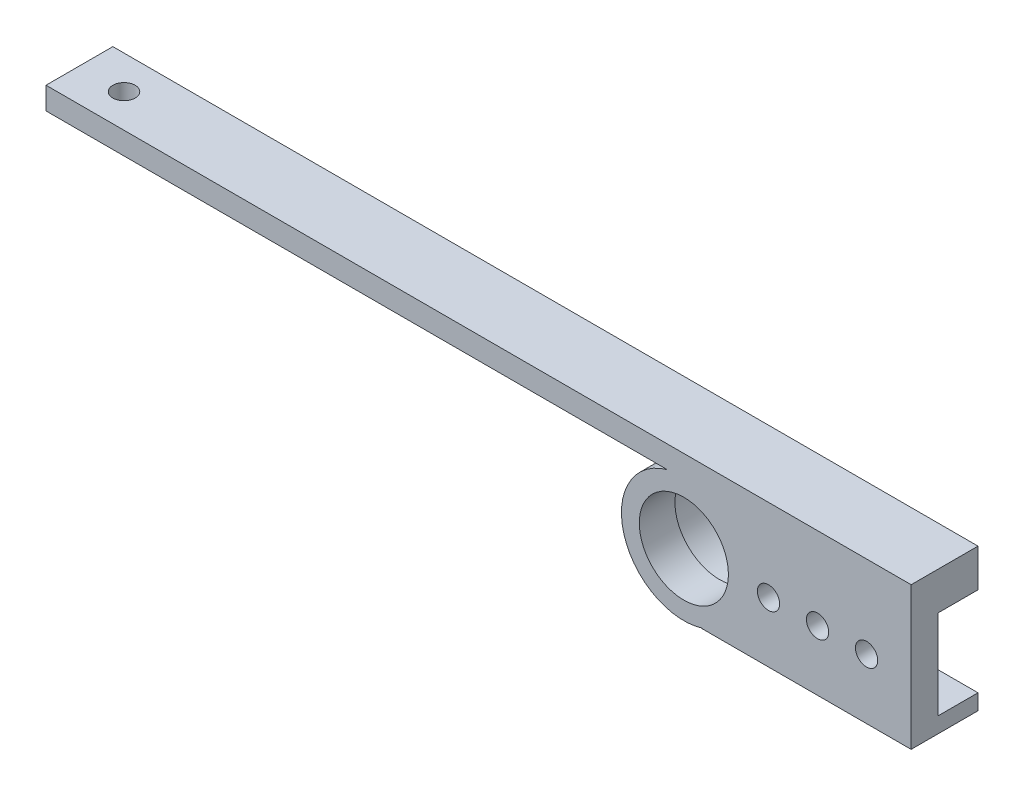
ISO-10303-21;
HEADER;
FILE_DESCRIPTION(('STEP AP214'),'2;1');
FILE_NAME('part.step','',(''),(''),'','','');
FILE_SCHEMA(('AUTOMOTIVE_DESIGN { 1 0 10303 214 1 1 1 1 }'));
ENDSEC;
DATA;
#1=APPLICATION_CONTEXT('core data for automotive mechanical design processes');
#2=APPLICATION_PROTOCOL_DEFINITION('international standard','automotive_design',2000,#1);
#3=PRODUCT_CONTEXT('',#1,'mechanical');
#4=PRODUCT('Part','Part','',(#3));
#5=PRODUCT_RELATED_PRODUCT_CATEGORY('part','',(#4));
#6=PRODUCT_DEFINITION_FORMATION('','',#4);
#7=PRODUCT_DEFINITION_CONTEXT('part definition',#1,'design');
#8=PRODUCT_DEFINITION('design','',#6,#7);
#9=PRODUCT_DEFINITION_SHAPE('','',#8);
#10=(LENGTH_UNIT() NAMED_UNIT(*) SI_UNIT(.MILLI.,.METRE.));
#11=(NAMED_UNIT(*) PLANE_ANGLE_UNIT() SI_UNIT($,.RADIAN.));
#12=(NAMED_UNIT(*) SI_UNIT($,.STERADIAN.) SOLID_ANGLE_UNIT());
#13=UNCERTAINTY_MEASURE_WITH_UNIT(LENGTH_MEASURE(1.E-05),#10,'distance_accuracy_value','');
#14=(GEOMETRIC_REPRESENTATION_CONTEXT(3) GLOBAL_UNCERTAINTY_ASSIGNED_CONTEXT((#13)) GLOBAL_UNIT_ASSIGNED_CONTEXT((#10,
#11,#12)) REPRESENTATION_CONTEXT('',''));
#15=CARTESIAN_POINT('',(0.,0.,0.));
#16=DIRECTION('',(0.,0.,1.));
#17=DIRECTION('',(1.,0.,0.));
#18=AXIS2_PLACEMENT_3D('',#15,#16,#17);
#19=CARTESIAN_POINT('',(-31.,0.,-9.));
#20=DIRECTION('',(0.,0.,1.));
#21=DIRECTION('',(1.,0.,0.));
#22=AXIS2_PLACEMENT_3D('',#19,#20,#21);
#23=CYLINDRICAL_SURFACE('',#22,11.);
#24=CARTESIAN_POINT('',(-31.,0.,-9.));
#25=DIRECTION('',(0.,0.,1.));
#26=DIRECTION('',(1.,0.,0.));
#27=AXIS2_PLACEMENT_3D('',#24,#25,#26);
#28=CIRCLE('',#27,11.);
#29=CARTESIAN_POINT('',(-20.,0.,-9.));
#30=VERTEX_POINT('',#29);
#31=EDGE_CURVE('E185',#30,#30,#28,.T.);
#32=ORIENTED_EDGE('',*,*,#31,.F.);
#33=EDGE_LOOP('',(#32));
#34=FACE_BOUND('',#33,.T.);
#35=CARTESIAN_POINT('',(-31.,0.,-2.));
#36=DIRECTION('',(0.,0.,1.));
#37=DIRECTION('',(1.,0.,0.));
#38=AXIS2_PLACEMENT_3D('',#35,#36,#37);
#39=CIRCLE('',#38,11.);
#40=CARTESIAN_POINT('',(-20.,0.,-2.));
#41=VERTEX_POINT('',#40);
#42=EDGE_CURVE('E11',#41,#41,#39,.F.);
#43=ORIENTED_EDGE('',*,*,#42,.F.);
#44=EDGE_LOOP('',(#43));
#45=FACE_BOUND('',#44,.T.);
#46=ADVANCED_FACE('F45',(#34,#45),#23,.F.);
#47=CARTESIAN_POINT('',(20.,-10.,6.));
#48=DIRECTION('',(-1.,0.,0.));
#49=DIRECTION('',(0.,0.,1.));
#50=AXIS2_PLACEMENT_3D('',#47,#48,#49);
#51=PLANE('',#50);
#52=DIRECTION('',(0.,1.,0.));
#53=VECTOR('',#52,1.);
#54=CARTESIAN_POINT('',(20.,-10.,0.));
#55=LINE('',#54,#53);
#56=CARTESIAN_POINT('',(20.,-10.,0.));
#57=VERTEX_POINT('',#56);
#58=CARTESIAN_POINT('',(20.,10.,0.));
#59=VERTEX_POINT('',#58);
#60=EDGE_CURVE('E276',#57,#59,#55,.T.);
#61=ORIENTED_EDGE('',*,*,#60,.T.);
#62=DIRECTION('',(0.,0.,1.));
#63=VECTOR('',#62,1.);
#64=CARTESIAN_POINT('',(20.,10.,-9.));
#65=LINE('',#64,#63);
#66=CARTESIAN_POINT('',(20.,10.,-9.));
#67=VERTEX_POINT('',#66);
#68=EDGE_CURVE('E241',#67,#59,#65,.T.);
#69=ORIENTED_EDGE('',*,*,#68,.F.);
#70=DIRECTION('',(0.,-1.,0.));
#71=VECTOR('',#70,1.);
#72=CARTESIAN_POINT('',(20.,0.,-9.));
#73=LINE('',#72,#71);
#74=CARTESIAN_POINT('',(20.,18.5,-9.));
#75=VERTEX_POINT('',#74);
#76=EDGE_CURVE('E197',#75,#67,#73,.T.);
#77=ORIENTED_EDGE('',*,*,#76,.F.);
#78=DIRECTION('',(0.,0.,1.));
#79=VECTOR('',#78,1.);
#80=CARTESIAN_POINT('',(20.,18.5,6.));
#81=LINE('',#80,#79);
#82=CARTESIAN_POINT('',(20.,18.5,6.));
#83=VERTEX_POINT('',#82);
#84=EDGE_CURVE('E168',#75,#83,#81,.T.);
#85=ORIENTED_EDGE('',*,*,#84,.T.);
#86=DIRECTION('',(0.,1.,0.));
#87=VECTOR('',#86,1.);
#88=CARTESIAN_POINT('',(20.,-10.,6.));
#89=LINE('',#88,#87);
#90=CARTESIAN_POINT('',(20.,-13.5,6.));
#91=VERTEX_POINT('',#90);
#92=EDGE_CURVE('E266',#91,#83,#89,.T.);
#93=ORIENTED_EDGE('',*,*,#92,.F.);
#94=DIRECTION('',(0.,0.,1.));
#95=VECTOR('',#94,1.);
#96=CARTESIAN_POINT('',(20.,-13.5,-9.));
#97=LINE('',#96,#95);
#98=CARTESIAN_POINT('',(20.,-13.5,-9.));
#99=VERTEX_POINT('',#98);
#100=EDGE_CURVE('E232',#99,#91,#97,.T.);
#101=ORIENTED_EDGE('',*,*,#100,.F.);
#102=DIRECTION('',(0.,-1.,0.));
#103=VECTOR('',#102,1.);
#104=CARTESIAN_POINT('',(20.,0.,-9.));
#105=LINE('',#104,#103);
#106=CARTESIAN_POINT('',(20.,-10.,-9.));
#107=VERTEX_POINT('',#106);
#108=EDGE_CURVE('E206',#107,#99,#105,.T.);
#109=ORIENTED_EDGE('',*,*,#108,.F.);
#110=DIRECTION('',(0.,0.,1.));
#111=VECTOR('',#110,1.);
#112=CARTESIAN_POINT('',(20.,-10.,-9.));
#113=LINE('',#112,#111);
#114=EDGE_CURVE('E229',#107,#57,#113,.T.);
#115=ORIENTED_EDGE('',*,*,#114,.T.);
#116=EDGE_LOOP('',(#61,#69,#77,#85,#93,#101,#109,#115));
#117=FACE_BOUND('',#116,.T.);
#118=ADVANCED_FACE('F47',(#117),#51,.F.);
#119=CARTESIAN_POINT('',(0.,0.,6.));
#120=DIRECTION('',(0.,0.,1.));
#121=DIRECTION('',(1.,0.,0.));
#122=AXIS2_PLACEMENT_3D('',#119,#120,#121);
#123=PLANE('',#122);
#124=DIRECTION('',(1.,0.,0.));
#125=VECTOR('',#124,1.);
#126=CARTESIAN_POINT('',(-180.,18.5,6.));
#127=LINE('',#126,#125);
#128=CARTESIAN_POINT('',(-174.110296742683,18.5,6.00000000000001));
#129=VERTEX_POINT('',#128);
#130=EDGE_CURVE('E172',#129,#83,#127,.T.);
#131=ORIENTED_EDGE('',*,*,#130,.F.);
#132=DIRECTION('',(0.,1.,0.));
#133=VECTOR('',#132,1.);
#134=CARTESIAN_POINT('',(-174.110296742683,13.5,6.00000000000001));
#135=LINE('',#134,#133);
#136=CARTESIAN_POINT('',(-174.110296742683,13.5,6.00000000000001));
#137=VERTEX_POINT('',#136);
#138=EDGE_CURVE('E158',#137,#129,#135,.T.);
#139=ORIENTED_EDGE('',*,*,#138,.F.);
#140=DIRECTION('',(1.,0.,0.));
#141=VECTOR('',#140,1.);
#142=CARTESIAN_POINT('',(-180.,13.5,6.));
#143=LINE('',#142,#141);
#144=CARTESIAN_POINT('',(-34.7080992435478,13.5,6.));
#145=VERTEX_POINT('',#144);
#146=EDGE_CURVE('E149',#137,#145,#143,.T.);
#147=ORIENTED_EDGE('',*,*,#146,.T.);
#148=CARTESIAN_POINT('',(-31.,0.,6.));
#149=DIRECTION('',(0.,0.,1.));
#150=DIRECTION('',(1.,0.,0.));
#151=AXIS2_PLACEMENT_3D('',#148,#149,#150);
#152=CIRCLE('',#151,14.);
#153=CARTESIAN_POINT('',(-26.8939671408107,-13.3843376436512,6.));
#154=VERTEX_POINT('',#153);
#155=EDGE_CURVE('E182',#145,#154,#152,.T.);
#156=ORIENTED_EDGE('',*,*,#155,.T.);
#157=DIRECTION('',(0.,1.,0.));
#158=VECTOR('',#157,1.);
#159=CARTESIAN_POINT('',(-26.8939671408107,0.,6.));
#160=LINE('',#159,#158);
#161=CARTESIAN_POINT('',(-26.8939671408107,-13.5,6.));
#162=VERTEX_POINT('',#161);
#163=EDGE_CURVE('E217',#162,#154,#160,.T.);
#164=ORIENTED_EDGE('',*,*,#163,.F.);
#165=DIRECTION('',(-1.,0.,0.));
#166=VECTOR('',#165,1.);
#167=CARTESIAN_POINT('',(0.,-13.5,6.));
#168=LINE('',#167,#166);
#169=EDGE_CURVE('E189',#91,#162,#168,.T.);
#170=ORIENTED_EDGE('',*,*,#169,.F.);
#171=ORIENTED_EDGE('',*,*,#92,.T.);
#172=EDGE_LOOP('',(#131,#139,#147,#156,#164,#170,#171));
#173=FACE_BOUND('',#172,.T.);
#174=CARTESIAN_POINT('',(10.,0.,6.));
#175=DIRECTION('',(0.,0.,1.));
#176=DIRECTION('',(1.,0.,0.));
#177=AXIS2_PLACEMENT_3D('',#174,#175,#176);
#178=CIRCLE('',#177,2.5);
#179=CARTESIAN_POINT('',(12.5,0.,6.));
#180=VERTEX_POINT('',#179);
#181=EDGE_CURVE('E252',#180,#180,#178,.T.);
#182=ORIENTED_EDGE('',*,*,#181,.F.);
#183=EDGE_LOOP('',(#182));
#184=FACE_BOUND('',#183,.T.);
#185=CARTESIAN_POINT('',(-0.999999999999999,0.,6.));
#186=DIRECTION('',(0.,0.,1.));
#187=DIRECTION('',(1.,0.,0.));
#188=AXIS2_PLACEMENT_3D('',#185,#186,#187);
#189=CIRCLE('',#188,2.5);
#190=CARTESIAN_POINT('',(1.5,0.,6.));
#191=VERTEX_POINT('',#190);
#192=EDGE_CURVE('E255',#191,#191,#189,.T.);
#193=ORIENTED_EDGE('',*,*,#192,.F.);
#194=EDGE_LOOP('',(#193));
#195=FACE_BOUND('',#194,.T.);
#196=CARTESIAN_POINT('',(-12.,-1.53625178909098E-13,6.));
#197=DIRECTION('',(0.,0.,1.));
#198=DIRECTION('',(1.,0.,0.));
#199=AXIS2_PLACEMENT_3D('',#196,#197,#198);
#200=CIRCLE('',#199,2.5);
#201=CARTESIAN_POINT('',(-9.5,-1.53625178909098E-13,6.));
#202=VERTEX_POINT('',#201);
#203=EDGE_CURVE('E261',#202,#202,#200,.T.);
#204=ORIENTED_EDGE('',*,*,#203,.F.);
#205=EDGE_LOOP('',(#204));
#206=FACE_BOUND('',#205,.T.);
#207=CARTESIAN_POINT('',(-31.,0.,6.));
#208=DIRECTION('',(0.,0.,1.));
#209=DIRECTION('',(1.,0.,0.));
#210=AXIS2_PLACEMENT_3D('',#207,#208,#209);
#211=CIRCLE('',#210,10.);
#212=CARTESIAN_POINT('',(-21.,0.,6.));
#213=VERTEX_POINT('',#212);
#214=EDGE_CURVE('E178',#213,#213,#211,.T.);
#215=ORIENTED_EDGE('',*,*,#214,.F.);
#216=EDGE_LOOP('',(#215));
#217=FACE_BOUND('',#216,.T.);
#218=ADVANCED_FACE('F310',(#173,#184,#195,#206,#217),#123,.T.);
#219=CARTESIAN_POINT('',(0.,0.,0.));
#220=DIRECTION('',(0.,0.,1.));
#221=DIRECTION('',(1.,0.,0.));
#222=AXIS2_PLACEMENT_3D('',#219,#220,#221);
#223=PLANE('',#222);
#224=CARTESIAN_POINT('',(10.,0.,0.));
#225=DIRECTION('',(0.,0.,1.));
#226=DIRECTION('',(1.,0.,0.));
#227=AXIS2_PLACEMENT_3D('',#224,#225,#226);
#228=CIRCLE('',#227,2.5);
#229=CARTESIAN_POINT('',(12.5,0.,0.));
#230=VERTEX_POINT('',#229);
#231=EDGE_CURVE('E249',#230,#230,#228,.T.);
#232=ORIENTED_EDGE('',*,*,#231,.T.);
#233=EDGE_LOOP('',(#232));
#234=FACE_BOUND('',#233,.T.);
#235=CARTESIAN_POINT('',(-0.999999999999999,0.,0.));
#236=DIRECTION('',(0.,0.,1.));
#237=DIRECTION('',(1.,0.,0.));
#238=AXIS2_PLACEMENT_3D('',#235,#236,#237);
#239=CIRCLE('',#238,2.5);
#240=CARTESIAN_POINT('',(1.5,0.,0.));
#241=VERTEX_POINT('',#240);
#242=EDGE_CURVE('E258',#241,#241,#239,.T.);
#243=ORIENTED_EDGE('',*,*,#242,.T.);
#244=EDGE_LOOP('',(#243));
#245=FACE_BOUND('',#244,.T.);
#246=CARTESIAN_POINT('',(-12.,-1.53625178909098E-13,0.));
#247=DIRECTION('',(0.,0.,1.));
#248=DIRECTION('',(1.,0.,0.));
#249=AXIS2_PLACEMENT_3D('',#246,#247,#248);
#250=CIRCLE('',#249,2.5);
#251=CARTESIAN_POINT('',(-9.5,-1.53625178909098E-13,0.));
#252=VERTEX_POINT('',#251);
#253=EDGE_CURVE('E225',#252,#252,#250,.T.);
#254=ORIENTED_EDGE('',*,*,#253,.T.);
#255=EDGE_LOOP('',(#254));
#256=FACE_BOUND('',#255,.T.);
#257=DIRECTION('',(0.,-1.,0.));
#258=VECTOR('',#257,1.);
#259=CARTESIAN_POINT('',(-20.,-10.,0.));
#260=LINE('',#259,#258);
#261=CARTESIAN_POINT('',(-20.,-8.66025403784439,0.));
#262=VERTEX_POINT('',#261);
#263=CARTESIAN_POINT('',(-20.,-10.,0.));
#264=VERTEX_POINT('',#263);
#265=EDGE_CURVE('E68',#262,#264,#260,.T.);
#266=ORIENTED_EDGE('',*,*,#265,.F.);
#267=CARTESIAN_POINT('',(-31.,0.,0.));
#268=DIRECTION('',(0.,0.,1.));
#269=DIRECTION('',(1.,0.,0.));
#270=AXIS2_PLACEMENT_3D('',#267,#268,#269);
#271=CIRCLE('',#270,14.);
#272=CARTESIAN_POINT('',(-20.,8.66025403784439,0.));
#273=VERTEX_POINT('',#272);
#274=EDGE_CURVE('E53',#262,#273,#271,.T.);
#275=ORIENTED_EDGE('',*,*,#274,.T.);
#276=CARTESIAN_POINT('',(-20.,10.,0.));
#277=VERTEX_POINT('',#276);
#278=EDGE_CURVE('E270',#277,#273,#260,.T.);
#279=ORIENTED_EDGE('',*,*,#278,.F.);
#280=DIRECTION('',(-1.,0.,0.));
#281=VECTOR('',#280,1.);
#282=CARTESIAN_POINT('',(20.,10.,0.));
#283=LINE('',#282,#281);
#284=EDGE_CURVE('E269',#59,#277,#283,.T.);
#285=ORIENTED_EDGE('',*,*,#284,.F.);
#286=ORIENTED_EDGE('',*,*,#60,.F.);
#287=DIRECTION('',(1.,0.,0.));
#288=VECTOR('',#287,1.);
#289=CARTESIAN_POINT('',(20.,-10.,0.));
#290=LINE('',#289,#288);
#291=EDGE_CURVE('E273',#264,#57,#290,.T.);
#292=ORIENTED_EDGE('',*,*,#291,.F.);
#293=EDGE_LOOP('',(#266,#275,#279,#285,#286,#292));
#294=FACE_BOUND('',#293,.T.);
#295=ADVANCED_FACE('F279',(#234,#245,#256,#294),#223,.F.);
#296=CARTESIAN_POINT('',(-12.,-1.53625178909098E-13,0.));
#297=DIRECTION('',(0.,0.,1.));
#298=DIRECTION('',(1.,0.,0.));
#299=AXIS2_PLACEMENT_3D('',#296,#297,#298);
#300=CYLINDRICAL_SURFACE('',#299,2.5);
#301=ORIENTED_EDGE('',*,*,#253,.F.);
#302=EDGE_LOOP('',(#301));
#303=FACE_BOUND('',#302,.T.);
#304=ORIENTED_EDGE('',*,*,#203,.T.);
#305=EDGE_LOOP('',(#304));
#306=FACE_BOUND('',#305,.T.);
#307=ADVANCED_FACE('F347',(#303,#306),#300,.F.);
#308=CARTESIAN_POINT('',(-0.999999999999999,0.,0.));
#309=DIRECTION('',(0.,0.,1.));
#310=DIRECTION('',(1.,0.,0.));
#311=AXIS2_PLACEMENT_3D('',#308,#309,#310);
#312=CYLINDRICAL_SURFACE('',#311,2.5);
#313=ORIENTED_EDGE('',*,*,#242,.F.);
#314=EDGE_LOOP('',(#313));
#315=FACE_BOUND('',#314,.T.);
#316=ORIENTED_EDGE('',*,*,#192,.T.);
#317=EDGE_LOOP('',(#316));
#318=FACE_BOUND('',#317,.T.);
#319=ADVANCED_FACE('F343',(#315,#318),#312,.F.);
#320=CARTESIAN_POINT('',(10.,0.,0.));
#321=DIRECTION('',(0.,0.,1.));
#322=DIRECTION('',(1.,0.,0.));
#323=AXIS2_PLACEMENT_3D('',#320,#321,#322);
#324=CYLINDRICAL_SURFACE('',#323,2.5);
#325=ORIENTED_EDGE('',*,*,#231,.F.);
#326=EDGE_LOOP('',(#325));
#327=FACE_BOUND('',#326,.T.);
#328=ORIENTED_EDGE('',*,*,#181,.T.);
#329=EDGE_LOOP('',(#328));
#330=FACE_BOUND('',#329,.T.);
#331=ADVANCED_FACE('F340',(#327,#330),#324,.F.);
#332=CARTESIAN_POINT('',(-31.,0.,-9.));
#333=DIRECTION('',(0.,0.,1.));
#334=DIRECTION('',(1.,0.,0.));
#335=AXIS2_PLACEMENT_3D('',#332,#333,#334);
#336=CYLINDRICAL_SURFACE('',#335,14.);
#337=ORIENTED_EDGE('',*,*,#274,.F.);
#338=DIRECTION('',(0.,0.,1.));
#339=VECTOR('',#338,1.);
#340=CARTESIAN_POINT('',(-20.,-8.66025403784439,-9.));
#341=LINE('',#340,#339);
#342=CARTESIAN_POINT('',(-20.,-8.66025403784439,-9.));
#343=VERTEX_POINT('',#342);
#344=EDGE_CURVE('E222',#343,#262,#341,.T.);
#345=ORIENTED_EDGE('',*,*,#344,.F.);
#346=CARTESIAN_POINT('',(-31.,0.,-9.));
#347=DIRECTION('',(0.,0.,1.));
#348=DIRECTION('',(1.,0.,0.));
#349=AXIS2_PLACEMENT_3D('',#346,#347,#348);
#350=CIRCLE('',#349,14.);
#351=CARTESIAN_POINT('',(-20.,8.66025403784439,-9.));
#352=VERTEX_POINT('',#351);
#353=EDGE_CURVE('E188',#343,#352,#350,.T.);
#354=ORIENTED_EDGE('',*,*,#353,.T.);
#355=DIRECTION('',(0.,0.,1.));
#356=VECTOR('',#355,1.);
#357=CARTESIAN_POINT('',(-20.,8.66025403784439,-9.));
#358=LINE('',#357,#356);
#359=EDGE_CURVE('E215',#352,#273,#358,.T.);
#360=ORIENTED_EDGE('',*,*,#359,.T.);
#361=EDGE_LOOP('',(#337,#345,#354,#360));
#362=FACE_BOUND('',#361,.T.);
#363=ADVANCED_FACE('F286',(#362),#336,.T.);
#364=CARTESIAN_POINT('',(-20.,0.,-9.));
#365=DIRECTION('',(-1.,0.,0.));
#366=DIRECTION('',(0.,0.,1.));
#367=AXIS2_PLACEMENT_3D('',#364,#365,#366);
#368=PLANE('',#367);
#369=ORIENTED_EDGE('',*,*,#344,.T.);
#370=ORIENTED_EDGE('',*,*,#265,.T.);
#371=DIRECTION('',(0.,0.,1.));
#372=VECTOR('',#371,1.);
#373=CARTESIAN_POINT('',(-20.,-10.,-9.));
#374=LINE('',#373,#372);
#375=CARTESIAN_POINT('',(-20.,-10.,-9.));
#376=VERTEX_POINT('',#375);
#377=EDGE_CURVE('E226',#376,#264,#374,.T.);
#378=ORIENTED_EDGE('',*,*,#377,.F.);
#379=DIRECTION('',(0.,-1.,0.));
#380=VECTOR('',#379,1.);
#381=CARTESIAN_POINT('',(-20.,0.,-9.));
#382=LINE('',#381,#380);
#383=EDGE_CURVE('E212',#343,#376,#382,.T.);
#384=ORIENTED_EDGE('',*,*,#383,.F.);
#385=EDGE_LOOP('',(#369,#370,#378,#384));
#386=FACE_BOUND('',#385,.T.);
#387=ADVANCED_FACE('F380',(#386),#368,.F.);
#388=CARTESIAN_POINT('',(0.,-10.,-9.));
#389=DIRECTION('',(0.,-1.,0.));
#390=DIRECTION('',(1.,0.,0.));
#391=AXIS2_PLACEMENT_3D('',#388,#389,#390);
#392=PLANE('',#391);
#393=ORIENTED_EDGE('',*,*,#377,.T.);
#394=ORIENTED_EDGE('',*,*,#291,.T.);
#395=ORIENTED_EDGE('',*,*,#114,.F.);
#396=DIRECTION('',(1.,0.,0.));
#397=VECTOR('',#396,1.);
#398=CARTESIAN_POINT('',(0.,-10.,-9.));
#399=LINE('',#398,#397);
#400=EDGE_CURVE('E209',#376,#107,#399,.T.);
#401=ORIENTED_EDGE('',*,*,#400,.F.);
#402=EDGE_LOOP('',(#393,#394,#395,#401));
#403=FACE_BOUND('',#402,.T.);
#404=ADVANCED_FACE('F297',(#403),#392,.F.);
#405=CARTESIAN_POINT('',(0.,10.,-9.));
#406=DIRECTION('',(0.,1.,0.));
#407=DIRECTION('',(-1.,0.,0.));
#408=AXIS2_PLACEMENT_3D('',#405,#406,#407);
#409=PLANE('',#408);
#410=ORIENTED_EDGE('',*,*,#68,.T.);
#411=ORIENTED_EDGE('',*,*,#284,.T.);
#412=DIRECTION('',(0.,0.,1.));
#413=VECTOR('',#412,1.);
#414=CARTESIAN_POINT('',(-20.,10.,-9.));
#415=LINE('',#414,#413);
#416=CARTESIAN_POINT('',(-20.,10.,-9.));
#417=VERTEX_POINT('',#416);
#418=EDGE_CURVE('E244',#417,#277,#415,.T.);
#419=ORIENTED_EDGE('',*,*,#418,.F.);
#420=DIRECTION('',(-1.,0.,0.));
#421=VECTOR('',#420,1.);
#422=CARTESIAN_POINT('',(0.,10.,-9.));
#423=LINE('',#422,#421);
#424=EDGE_CURVE('E194',#67,#417,#423,.T.);
#425=ORIENTED_EDGE('',*,*,#424,.F.);
#426=EDGE_LOOP('',(#410,#411,#419,#425));
#427=FACE_BOUND('',#426,.T.);
#428=ADVANCED_FACE('F293',(#427),#409,.F.);
#429=CARTESIAN_POINT('',(-20.,0.,-9.));
#430=DIRECTION('',(-1.,0.,0.));
#431=DIRECTION('',(0.,0.,1.));
#432=AXIS2_PLACEMENT_3D('',#429,#430,#431);
#433=PLANE('',#432);
#434=ORIENTED_EDGE('',*,*,#418,.T.);
#435=ORIENTED_EDGE('',*,*,#278,.T.);
#436=ORIENTED_EDGE('',*,*,#359,.F.);
#437=DIRECTION('',(0.,-1.,0.));
#438=VECTOR('',#437,1.);
#439=CARTESIAN_POINT('',(-20.,0.,-9.));
#440=LINE('',#439,#438);
#441=EDGE_CURVE('E192',#417,#352,#440,.T.);
#442=ORIENTED_EDGE('',*,*,#441,.F.);
#443=EDGE_LOOP('',(#434,#435,#436,#442));
#444=FACE_BOUND('',#443,.T.);
#445=ADVANCED_FACE('F284',(#444),#433,.F.);
#446=CARTESIAN_POINT('',(0.,-13.5,-9.));
#447=DIRECTION('',(0.,1.,0.));
#448=DIRECTION('',(0.,0.,1.));
#449=AXIS2_PLACEMENT_3D('',#446,#447,#448);
#450=PLANE('',#449);
#451=ORIENTED_EDGE('',*,*,#169,.T.);
#452=DIRECTION('',(0.,0.,1.));
#453=VECTOR('',#452,1.);
#454=CARTESIAN_POINT('',(-26.8939671408107,-13.5,-9.));
#455=LINE('',#454,#453);
#456=CARTESIAN_POINT('',(-26.8939671408107,-13.5,-9.));
#457=VERTEX_POINT('',#456);
#458=EDGE_CURVE('E235',#457,#162,#455,.T.);
#459=ORIENTED_EDGE('',*,*,#458,.F.);
#460=DIRECTION('',(-1.,0.,0.));
#461=VECTOR('',#460,1.);
#462=CARTESIAN_POINT('',(0.,-13.5,-9.));
#463=LINE('',#462,#461);
#464=EDGE_CURVE('E203',#99,#457,#463,.T.);
#465=ORIENTED_EDGE('',*,*,#464,.F.);
#466=ORIENTED_EDGE('',*,*,#100,.T.);
#467=EDGE_LOOP('',(#451,#459,#465,#466));
#468=FACE_BOUND('',#467,.T.);
#469=ADVANCED_FACE('F302',(#468),#450,.F.);
#470=CARTESIAN_POINT('',(-26.8939671408107,0.,-9.));
#471=DIRECTION('',(1.,0.,0.));
#472=DIRECTION('',(0.,0.,-1.));
#473=AXIS2_PLACEMENT_3D('',#470,#471,#472);
#474=PLANE('',#473);
#475=ORIENTED_EDGE('',*,*,#163,.T.);
#476=DIRECTION('',(0.,0.,1.));
#477=VECTOR('',#476,1.);
#478=CARTESIAN_POINT('',(-26.8939671408107,-13.3843376436512,-9.));
#479=LINE('',#478,#477);
#480=CARTESIAN_POINT('',(-26.8939671408107,-13.3843376436512,-9.));
#481=VERTEX_POINT('',#480);
#482=EDGE_CURVE('E238',#481,#154,#479,.T.);
#483=ORIENTED_EDGE('',*,*,#482,.F.);
#484=DIRECTION('',(0.,1.,0.));
#485=VECTOR('',#484,1.);
#486=CARTESIAN_POINT('',(-26.8939671408107,0.,-9.));
#487=LINE('',#486,#485);
#488=EDGE_CURVE('E201',#457,#481,#487,.T.);
#489=ORIENTED_EDGE('',*,*,#488,.F.);
#490=ORIENTED_EDGE('',*,*,#458,.T.);
#491=EDGE_LOOP('',(#475,#483,#489,#490));
#492=FACE_BOUND('',#491,.T.);
#493=ADVANCED_FACE('F305',(#492),#474,.F.);
#494=CARTESIAN_POINT('',(-31.,0.,-9.));
#495=DIRECTION('',(0.,0.,1.));
#496=DIRECTION('',(1.,0.,0.));
#497=AXIS2_PLACEMENT_3D('',#494,#495,#496);
#498=CYLINDRICAL_SURFACE('',#497,14.);
#499=DIRECTION('',(0.,0.,1.));
#500=VECTOR('',#499,1.);
#501=CARTESIAN_POINT('',(-34.7080992435478,13.5,-9.));
#502=LINE('',#501,#500);
#503=CARTESIAN_POINT('',(-34.7080992435478,13.5,-9.));
#504=VERTEX_POINT('',#503);
#505=EDGE_CURVE('E174',#504,#145,#502,.T.);
#506=ORIENTED_EDGE('',*,*,#505,.F.);
#507=CARTESIAN_POINT('',(-31.,0.,-9.));
#508=DIRECTION('',(0.,0.,1.));
#509=DIRECTION('',(1.,0.,0.));
#510=AXIS2_PLACEMENT_3D('',#507,#508,#509);
#511=CIRCLE('',#510,14.);
#512=EDGE_CURVE('E147',#504,#481,#511,.T.);
#513=ORIENTED_EDGE('',*,*,#512,.T.);
#514=ORIENTED_EDGE('',*,*,#482,.T.);
#515=ORIENTED_EDGE('',*,*,#155,.F.);
#516=EDGE_LOOP('',(#506,#513,#514,#515));
#517=FACE_BOUND('',#516,.T.);
#518=ADVANCED_FACE('F308',(#517),#498,.T.);
#519=CARTESIAN_POINT('',(0.,0.,-9.));
#520=DIRECTION('',(0.,0.,1.));
#521=DIRECTION('',(1.,0.,0.));
#522=AXIS2_PLACEMENT_3D('',#519,#520,#521);
#523=PLANE('',#522);
#524=DIRECTION('',(1.,0.,0.));
#525=VECTOR('',#524,1.);
#526=CARTESIAN_POINT('',(-180.,13.5,-9.));
#527=LINE('',#526,#525);
#528=CARTESIAN_POINT('',(-174.110296742683,13.5,-9.));
#529=VERTEX_POINT('',#528);
#530=EDGE_CURVE('E60',#529,#504,#527,.T.);
#531=ORIENTED_EDGE('',*,*,#530,.F.);
#532=DIRECTION('',(0.,1.,0.));
#533=VECTOR('',#532,1.);
#534=CARTESIAN_POINT('',(-174.110296742683,13.5,-9.));
#535=LINE('',#534,#533);
#536=CARTESIAN_POINT('',(-174.110296742683,18.5,-9.));
#537=VERTEX_POINT('',#536);
#538=EDGE_CURVE('E144',#529,#537,#535,.T.);
#539=ORIENTED_EDGE('',*,*,#538,.T.);
#540=DIRECTION('',(1.,0.,0.));
#541=VECTOR('',#540,1.);
#542=CARTESIAN_POINT('',(-180.,18.5,-9.));
#543=LINE('',#542,#541);
#544=EDGE_CURVE('E148',#537,#75,#543,.T.);
#545=ORIENTED_EDGE('',*,*,#544,.T.);
#546=ORIENTED_EDGE('',*,*,#76,.T.);
#547=ORIENTED_EDGE('',*,*,#424,.T.);
#548=ORIENTED_EDGE('',*,*,#441,.T.);
#549=ORIENTED_EDGE('',*,*,#353,.F.);
#550=ORIENTED_EDGE('',*,*,#383,.T.);
#551=ORIENTED_EDGE('',*,*,#400,.T.);
#552=ORIENTED_EDGE('',*,*,#108,.T.);
#553=ORIENTED_EDGE('',*,*,#464,.T.);
#554=ORIENTED_EDGE('',*,*,#488,.T.);
#555=ORIENTED_EDGE('',*,*,#512,.F.);
#556=EDGE_LOOP('',(#531,#539,#545,#546,#547,#548,#549,#550,#551,#552,#553,#554,#555));
#557=FACE_BOUND('',#556,.T.);
#558=ORIENTED_EDGE('',*,*,#31,.T.);
#559=EDGE_LOOP('',(#558));
#560=FACE_BOUND('',#559,.T.);
#561=ADVANCED_FACE('F142',(#557,#560),#523,.F.);
#562=CARTESIAN_POINT('',(-31.,0.,-2.));
#563=DIRECTION('',(0.,0.,1.));
#564=DIRECTION('',(1.,0.,0.));
#565=AXIS2_PLACEMENT_3D('',#562,#563,#564);
#566=PLANE('',#565);
#567=CARTESIAN_POINT('',(-31.,0.,-2.));
#568=DIRECTION('',(0.,0.,1.));
#569=DIRECTION('',(1.,0.,0.));
#570=AXIS2_PLACEMENT_3D('',#567,#568,#569);
#571=CIRCLE('',#570,10.);
#572=CARTESIAN_POINT('',(-21.,0.,-2.));
#573=VERTEX_POINT('',#572);
#574=EDGE_CURVE('E179',#573,#573,#571,.T.);
#575=ORIENTED_EDGE('',*,*,#574,.T.);
#576=EDGE_LOOP('',(#575));
#577=FACE_BOUND('',#576,.T.);
#578=ORIENTED_EDGE('',*,*,#42,.T.);
#579=EDGE_LOOP('',(#578));
#580=FACE_BOUND('',#579,.T.);
#581=ADVANCED_FACE('F368',(#577,#580),#566,.F.);
#582=CARTESIAN_POINT('',(-31.,0.,-2.));
#583=DIRECTION('',(0.,0.,1.));
#584=DIRECTION('',(1.,0.,0.));
#585=AXIS2_PLACEMENT_3D('',#582,#583,#584);
#586=CYLINDRICAL_SURFACE('',#585,10.);
#587=ORIENTED_EDGE('',*,*,#574,.F.);
#588=EDGE_LOOP('',(#587));
#589=FACE_BOUND('',#588,.T.);
#590=ORIENTED_EDGE('',*,*,#214,.T.);
#591=EDGE_LOOP('',(#590));
#592=FACE_BOUND('',#591,.T.);
#593=ADVANCED_FACE('F324',(#589,#592),#586,.F.);
#594=CARTESIAN_POINT('',(-180.,13.5,6.));
#595=DIRECTION('',(0.,-1.,0.));
#596=DIRECTION('',(0.,0.,-1.));
#597=AXIS2_PLACEMENT_3D('',#594,#595,#596);
#598=PLANE('',#597);
#599=CARTESIAN_POINT('',(-164.110296742683,13.5,-1.5));
#600=DIRECTION('',(0.,-1.,0.));
#601=DIRECTION('',(0.,0.,-1.));
#602=AXIS2_PLACEMENT_3D('',#599,#600,#601);
#603=CIRCLE('',#602,2.5);
#604=CARTESIAN_POINT('',(-164.110296742683,13.5,-3.99999999999999));
#605=VERTEX_POINT('',#604);
#606=EDGE_CURVE('E163',#605,#605,#603,.T.);
#607=ORIENTED_EDGE('',*,*,#606,.F.);
#608=EDGE_LOOP('',(#607));
#609=FACE_BOUND('',#608,.T.);
#610=ORIENTED_EDGE('',*,*,#146,.F.);
#611=DIRECTION('',(0.,0.,1.));
#612=VECTOR('',#611,1.);
#613=CARTESIAN_POINT('',(-174.110296742683,13.5,6.00000000000001));
#614=LINE('',#613,#612);
#615=EDGE_CURVE('E155',#529,#137,#614,.T.);
#616=ORIENTED_EDGE('',*,*,#615,.F.);
#617=ORIENTED_EDGE('',*,*,#530,.T.);
#618=ORIENTED_EDGE('',*,*,#505,.T.);
#619=EDGE_LOOP('',(#610,#616,#617,#618));
#620=FACE_BOUND('',#619,.T.);
#621=ADVANCED_FACE('F160',(#609,#620),#598,.T.);
#622=CARTESIAN_POINT('',(-180.,18.5,6.));
#623=DIRECTION('',(0.,1.,0.));
#624=DIRECTION('',(0.,0.,1.));
#625=AXIS2_PLACEMENT_3D('',#622,#623,#624);
#626=PLANE('',#625);
#627=CARTESIAN_POINT('',(-164.110296742683,18.5,-1.5));
#628=DIRECTION('',(0.,1.,0.));
#629=DIRECTION('',(0.,0.,1.));
#630=AXIS2_PLACEMENT_3D('',#627,#628,#629);
#631=CIRCLE('',#630,2.5);
#632=CARTESIAN_POINT('',(-164.110296742683,18.5,1.));
#633=VERTEX_POINT('',#632);
#634=EDGE_CURVE('E651',#633,#633,#631,.T.);
#635=ORIENTED_EDGE('',*,*,#634,.F.);
#636=EDGE_LOOP('',(#635));
#637=FACE_BOUND('',#636,.T.);
#638=ORIENTED_EDGE('',*,*,#544,.F.);
#639=DIRECTION('',(0.,0.,1.));
#640=VECTOR('',#639,1.);
#641=CARTESIAN_POINT('',(-174.110296742683,18.5,6.00000000000001));
#642=LINE('',#641,#640);
#643=EDGE_CURVE('E157',#537,#129,#642,.T.);
#644=ORIENTED_EDGE('',*,*,#643,.T.);
#645=ORIENTED_EDGE('',*,*,#130,.T.);
#646=ORIENTED_EDGE('',*,*,#84,.F.);
#647=EDGE_LOOP('',(#638,#644,#645,#646));
#648=FACE_BOUND('',#647,.T.);
#649=ADVANCED_FACE('F313',(#637,#648),#626,.T.);
#650=CARTESIAN_POINT('',(-174.110296742683,13.5,6.00000000000001));
#651=DIRECTION('',(-1.,0.,0.));
#652=DIRECTION('',(0.,0.,1.));
#653=AXIS2_PLACEMENT_3D('',#650,#651,#652);
#654=PLANE('',#653);
#655=ORIENTED_EDGE('',*,*,#643,.F.);
#656=ORIENTED_EDGE('',*,*,#538,.F.);
#657=ORIENTED_EDGE('',*,*,#615,.T.);
#658=ORIENTED_EDGE('',*,*,#138,.T.);
#659=EDGE_LOOP('',(#655,#656,#657,#658));
#660=FACE_BOUND('',#659,.T.);
#661=ADVANCED_FACE('F153',(#660),#654,.T.);
#662=CARTESIAN_POINT('',(-164.110296742683,8.5,-1.5));
#663=DIRECTION('',(0.,1.,0.));
#664=DIRECTION('',(0.,0.,1.));
#665=AXIS2_PLACEMENT_3D('',#662,#663,#664);
#666=CYLINDRICAL_SURFACE('',#665,2.5);
#667=ORIENTED_EDGE('',*,*,#606,.T.);
#668=EDGE_LOOP('',(#667));
#669=FACE_BOUND('',#668,.T.);
#670=ORIENTED_EDGE('',*,*,#634,.T.);
#671=EDGE_LOOP('',(#670));
#672=FACE_BOUND('',#671,.T.);
#673=ADVANCED_FACE('F322',(#669,#672),#666,.F.);
#674=CLOSED_SHELL('',(#46,#118,#218,#295,#307,#319,#331,#363,#387,#404,#428,#445,#469,#493,#518,
#561,#581,#593,#621,#649,#661,#673));
#675=MANIFOLD_SOLID_BREP('B2',#674);
#676=ADVANCED_BREP_SHAPE_REPRESENTATION('',(#18,#675),#14);
#677=SHAPE_DEFINITION_REPRESENTATION(#9,#676);
ENDSEC;
END-ISO-10303-21;
